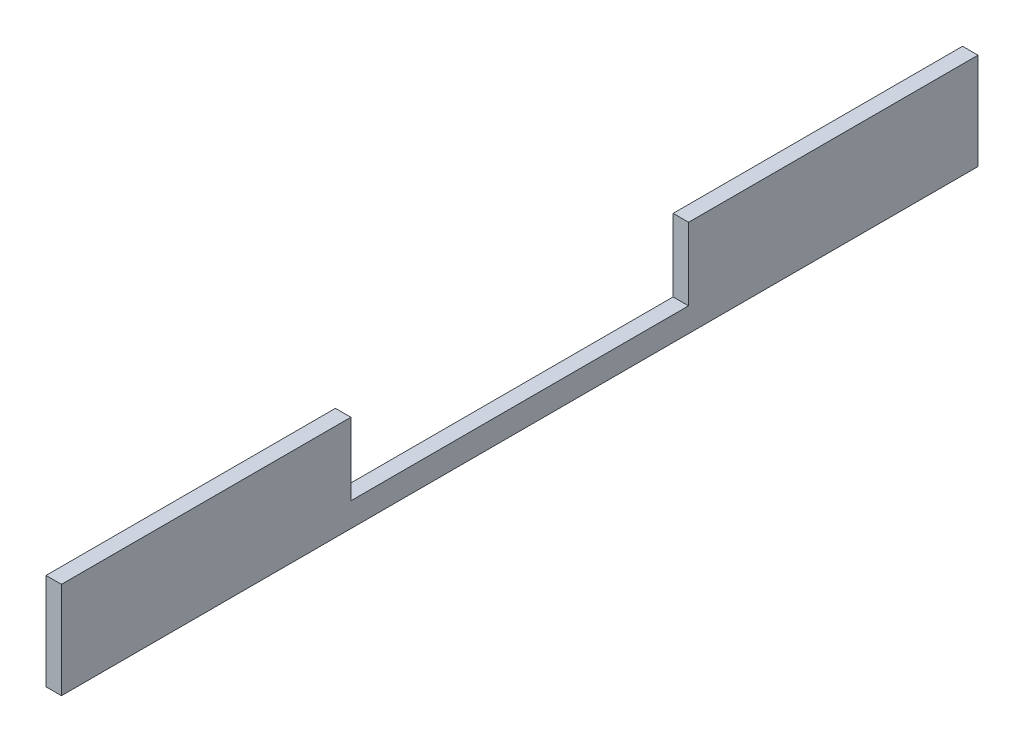
ISO-10303-21;
HEADER;
FILE_DESCRIPTION(('STEP AP214'),'2;1');
FILE_NAME('part.step','',(''),(''),'','','');
FILE_SCHEMA(('AUTOMOTIVE_DESIGN { 1 0 10303 214 1 1 1 1 }'));
ENDSEC;
DATA;
#1=APPLICATION_CONTEXT('core data for automotive mechanical design processes');
#2=APPLICATION_PROTOCOL_DEFINITION('international standard','automotive_design',2000,#1);
#3=PRODUCT_CONTEXT('',#1,'mechanical');
#4=PRODUCT('Part','Part','',(#3));
#5=PRODUCT_RELATED_PRODUCT_CATEGORY('part','',(#4));
#6=PRODUCT_DEFINITION_FORMATION('','',#4);
#7=PRODUCT_DEFINITION_CONTEXT('part definition',#1,'design');
#8=PRODUCT_DEFINITION('design','',#6,#7);
#9=PRODUCT_DEFINITION_SHAPE('','',#8);
#10=(LENGTH_UNIT() NAMED_UNIT(*) SI_UNIT(.MILLI.,.METRE.));
#11=(NAMED_UNIT(*) PLANE_ANGLE_UNIT() SI_UNIT($,.RADIAN.));
#12=(NAMED_UNIT(*) SI_UNIT($,.STERADIAN.) SOLID_ANGLE_UNIT());
#13=UNCERTAINTY_MEASURE_WITH_UNIT(LENGTH_MEASURE(1.E-05),#10,'distance_accuracy_value','');
#14=(GEOMETRIC_REPRESENTATION_CONTEXT(3) GLOBAL_UNCERTAINTY_ASSIGNED_CONTEXT((#13)) GLOBAL_UNIT_ASSIGNED_CONTEXT((#10,
#11,#12)) REPRESENTATION_CONTEXT('',''));
#15=CARTESIAN_POINT('',(0.,0.,0.));
#16=DIRECTION('',(0.,0.,1.));
#17=DIRECTION('',(1.,0.,0.));
#18=AXIS2_PLACEMENT_3D('',#15,#16,#17);
#19=CARTESIAN_POINT('',(3.2,20.,0.));
#20=DIRECTION('',(0.,-1.,0.));
#21=DIRECTION('',(0.,0.,-1.));
#22=AXIS2_PLACEMENT_3D('',#19,#20,#21);
#23=PLANE('',#22);
#24=DIRECTION('',(-1.,0.,0.));
#25=VECTOR('',#24,1.);
#26=CARTESIAN_POINT('',(10.,20.,-60.));
#27=LINE('',#26,#25);
#28=CARTESIAN_POINT('',(3.2,20.,-60.));
#29=VERTEX_POINT('',#28);
#30=CARTESIAN_POINT('',(0.,20.,-60.));
#31=VERTEX_POINT('',#30);
#32=EDGE_CURVE('E121',#29,#31,#27,.T.);
#33=ORIENTED_EDGE('',*,*,#32,.T.);
#34=DIRECTION('',(0.,0.,1.));
#35=VECTOR('',#34,1.);
#36=CARTESIAN_POINT('',(0.,20.,0.));
#37=LINE('',#36,#35);
#38=CARTESIAN_POINT('',(0.,20.,0.));
#39=VERTEX_POINT('',#38);
#40=EDGE_CURVE('E84',#31,#39,#37,.T.);
#41=ORIENTED_EDGE('',*,*,#40,.T.);
#42=DIRECTION('',(-1.,0.,0.));
#43=VECTOR('',#42,1.);
#44=CARTESIAN_POINT('',(3.2,20.,0.));
#45=LINE('',#44,#43);
#46=CARTESIAN_POINT('',(3.2,20.,0.));
#47=VERTEX_POINT('',#46);
#48=EDGE_CURVE('E154',#47,#39,#45,.T.);
#49=ORIENTED_EDGE('',*,*,#48,.F.);
#50=DIRECTION('',(0.,0.,1.));
#51=VECTOR('',#50,1.);
#52=CARTESIAN_POINT('',(3.2,20.,0.));
#53=LINE('',#52,#51);
#54=EDGE_CURVE('E62',#29,#47,#53,.T.);
#55=ORIENTED_EDGE('',*,*,#54,.F.);
#56=EDGE_LOOP('',(#33,#41,#49,#55));
#57=FACE_BOUND('',#56,.T.);
#58=ADVANCED_FACE('F38',(#57),#23,.F.);
#59=CARTESIAN_POINT('',(3.2,0.,0.));
#60=DIRECTION('',(0.,0.,-1.));
#61=DIRECTION('',(-1.,0.,0.));
#62=AXIS2_PLACEMENT_3D('',#59,#60,#61);
#63=PLANE('',#62);
#64=DIRECTION('',(0.,-1.,0.));
#65=VECTOR('',#64,1.);
#66=CARTESIAN_POINT('',(0.,0.,0.));
#67=LINE('',#66,#65);
#68=CARTESIAN_POINT('',(0.,0.,0.));
#69=VERTEX_POINT('',#68);
#70=EDGE_CURVE('E144',#39,#69,#67,.T.);
#71=ORIENTED_EDGE('',*,*,#70,.T.);
#72=DIRECTION('',(-1.,0.,0.));
#73=VECTOR('',#72,1.);
#74=CARTESIAN_POINT('',(3.2,0.,0.));
#75=LINE('',#74,#73);
#76=CARTESIAN_POINT('',(3.2,0.,0.));
#77=VERTEX_POINT('',#76);
#78=EDGE_CURVE('E11',#77,#69,#75,.T.);
#79=ORIENTED_EDGE('',*,*,#78,.F.);
#80=DIRECTION('',(0.,-1.,0.));
#81=VECTOR('',#80,1.);
#82=CARTESIAN_POINT('',(3.2,0.,0.));
#83=LINE('',#82,#81);
#84=EDGE_CURVE('E145',#47,#77,#83,.T.);
#85=ORIENTED_EDGE('',*,*,#84,.F.);
#86=ORIENTED_EDGE('',*,*,#48,.T.);
#87=EDGE_LOOP('',(#71,#79,#85,#86));
#88=FACE_BOUND('',#87,.T.);
#89=ADVANCED_FACE('F40',(#88),#63,.F.);
#90=CARTESIAN_POINT('',(3.2,0.,0.));
#91=DIRECTION('',(0.,1.,0.));
#92=DIRECTION('',(0.,0.,1.));
#93=AXIS2_PLACEMENT_3D('',#90,#91,#92);
#94=PLANE('',#93);
#95=DIRECTION('',(0.,0.,-1.));
#96=VECTOR('',#95,1.);
#97=CARTESIAN_POINT('',(0.,0.,0.));
#98=LINE('',#97,#96);
#99=CARTESIAN_POINT('',(0.,0.,-190.));
#100=VERTEX_POINT('',#99);
#101=EDGE_CURVE('E157',#69,#100,#98,.T.);
#102=ORIENTED_EDGE('',*,*,#101,.T.);
#103=DIRECTION('',(-1.,0.,0.));
#104=VECTOR('',#103,1.);
#105=CARTESIAN_POINT('',(3.2,0.,-190.));
#106=LINE('',#105,#104);
#107=CARTESIAN_POINT('',(3.2,0.,-190.));
#108=VERTEX_POINT('',#107);
#109=EDGE_CURVE('E46',#108,#100,#106,.T.);
#110=ORIENTED_EDGE('',*,*,#109,.F.);
#111=DIRECTION('',(0.,0.,-1.));
#112=VECTOR('',#111,1.);
#113=CARTESIAN_POINT('',(3.2,0.,0.));
#114=LINE('',#113,#112);
#115=EDGE_CURVE('E91',#77,#108,#114,.T.);
#116=ORIENTED_EDGE('',*,*,#115,.F.);
#117=ORIENTED_EDGE('',*,*,#78,.T.);
#118=EDGE_LOOP('',(#102,#110,#116,#117));
#119=FACE_BOUND('',#118,.T.);
#120=ADVANCED_FACE('F181',(#119),#94,.F.);
#121=CARTESIAN_POINT('',(3.2,0.,-190.));
#122=DIRECTION('',(0.,0.,1.));
#123=DIRECTION('',(1.,0.,0.));
#124=AXIS2_PLACEMENT_3D('',#121,#122,#123);
#125=PLANE('',#124);
#126=DIRECTION('',(0.,1.,0.));
#127=VECTOR('',#126,1.);
#128=CARTESIAN_POINT('',(0.,0.,-190.));
#129=LINE('',#128,#127);
#130=CARTESIAN_POINT('',(0.,20.,-190.));
#131=VERTEX_POINT('',#130);
#132=EDGE_CURVE('E159',#100,#131,#129,.T.);
#133=ORIENTED_EDGE('',*,*,#132,.T.);
#134=DIRECTION('',(-1.,0.,0.));
#135=VECTOR('',#134,1.);
#136=CARTESIAN_POINT('',(3.2,20.,-190.));
#137=LINE('',#136,#135);
#138=CARTESIAN_POINT('',(3.2,20.,-190.));
#139=VERTEX_POINT('',#138);
#140=EDGE_CURVE('E164',#139,#131,#137,.T.);
#141=ORIENTED_EDGE('',*,*,#140,.F.);
#142=DIRECTION('',(0.,1.,0.));
#143=VECTOR('',#142,1.);
#144=CARTESIAN_POINT('',(3.2,0.,-190.));
#145=LINE('',#144,#143);
#146=EDGE_CURVE('E149',#108,#139,#145,.T.);
#147=ORIENTED_EDGE('',*,*,#146,.F.);
#148=ORIENTED_EDGE('',*,*,#109,.T.);
#149=EDGE_LOOP('',(#133,#141,#147,#148));
#150=FACE_BOUND('',#149,.T.);
#151=ADVANCED_FACE('F170',(#150),#125,.F.);
#152=CARTESIAN_POINT('',(0.,20.,-130.));
#153=VERTEX_POINT('',#152);
#154=EDGE_CURVE('E147',#131,#153,#37,.T.);
#155=ORIENTED_EDGE('',*,*,#154,.T.);
#156=DIRECTION('',(-1.,0.,0.));
#157=VECTOR('',#156,1.);
#158=CARTESIAN_POINT('',(10.,20.,-130.));
#159=LINE('',#158,#157);
#160=CARTESIAN_POINT('',(3.2,20.,-130.));
#161=VERTEX_POINT('',#160);
#162=EDGE_CURVE('E135',#161,#153,#159,.T.);
#163=ORIENTED_EDGE('',*,*,#162,.F.);
#164=EDGE_CURVE('E151',#139,#161,#53,.T.);
#165=ORIENTED_EDGE('',*,*,#164,.F.);
#166=ORIENTED_EDGE('',*,*,#140,.T.);
#167=EDGE_LOOP('',(#155,#163,#165,#166));
#168=FACE_BOUND('',#167,.T.);
#169=ADVANCED_FACE('F175',(#168),#23,.F.);
#170=CARTESIAN_POINT('',(3.2,0.,0.));
#171=DIRECTION('',(-1.,0.,0.));
#172=DIRECTION('',(0.,0.,1.));
#173=AXIS2_PLACEMENT_3D('',#170,#171,#172);
#174=PLANE('',#173);
#175=ORIENTED_EDGE('',*,*,#164,.T.);
#176=DIRECTION('',(0.,-1.,0.));
#177=VECTOR('',#176,1.);
#178=CARTESIAN_POINT('',(3.2,0.,-130.));
#179=LINE('',#178,#177);
#180=CARTESIAN_POINT('',(3.2,5.,-130.));
#181=VERTEX_POINT('',#180);
#182=EDGE_CURVE('E141',#161,#181,#179,.T.);
#183=ORIENTED_EDGE('',*,*,#182,.T.);
#184=DIRECTION('',(0.,0.,1.));
#185=VECTOR('',#184,1.);
#186=CARTESIAN_POINT('',(3.2,5.00000000000001,0.));
#187=LINE('',#186,#185);
#188=CARTESIAN_POINT('',(3.2,5.00000000000001,-60.));
#189=VERTEX_POINT('',#188);
#190=EDGE_CURVE('E137',#181,#189,#187,.T.);
#191=ORIENTED_EDGE('',*,*,#190,.T.);
#192=DIRECTION('',(0.,-1.,0.));
#193=VECTOR('',#192,1.);
#194=CARTESIAN_POINT('',(3.2,0.,-60.));
#195=LINE('',#194,#193);
#196=EDGE_CURVE('E118',#29,#189,#195,.T.);
#197=ORIENTED_EDGE('',*,*,#196,.F.);
#198=ORIENTED_EDGE('',*,*,#54,.T.);
#199=ORIENTED_EDGE('',*,*,#84,.T.);
#200=ORIENTED_EDGE('',*,*,#115,.T.);
#201=ORIENTED_EDGE('',*,*,#146,.T.);
#202=EDGE_LOOP('',(#175,#183,#191,#197,#198,#199,#200,#201));
#203=FACE_BOUND('',#202,.T.);
#204=ADVANCED_FACE('F177',(#203),#174,.F.);
#205=CARTESIAN_POINT('',(0.,0.,0.));
#206=DIRECTION('',(-1.,0.,0.));
#207=DIRECTION('',(0.,0.,1.));
#208=AXIS2_PLACEMENT_3D('',#205,#206,#207);
#209=PLANE('',#208);
#210=DIRECTION('',(0.,-1.,0.));
#211=VECTOR('',#210,1.);
#212=CARTESIAN_POINT('',(0.,0.,-130.));
#213=LINE('',#212,#211);
#214=CARTESIAN_POINT('',(0.,5.,-130.));
#215=VERTEX_POINT('',#214);
#216=EDGE_CURVE('E53',#153,#215,#213,.T.);
#217=ORIENTED_EDGE('',*,*,#216,.F.);
#218=ORIENTED_EDGE('',*,*,#154,.F.);
#219=ORIENTED_EDGE('',*,*,#132,.F.);
#220=ORIENTED_EDGE('',*,*,#101,.F.);
#221=ORIENTED_EDGE('',*,*,#70,.F.);
#222=ORIENTED_EDGE('',*,*,#40,.F.);
#223=DIRECTION('',(0.,-1.,0.));
#224=VECTOR('',#223,1.);
#225=CARTESIAN_POINT('',(0.,0.,-60.));
#226=LINE('',#225,#224);
#227=CARTESIAN_POINT('',(0.,5.00000000000001,-60.));
#228=VERTEX_POINT('',#227);
#229=EDGE_CURVE('E117',#31,#228,#226,.T.);
#230=ORIENTED_EDGE('',*,*,#229,.T.);
#231=DIRECTION('',(0.,0.,1.));
#232=VECTOR('',#231,1.);
#233=CARTESIAN_POINT('',(0.,5.00000000000001,0.));
#234=LINE('',#233,#232);
#235=EDGE_CURVE('E125',#215,#228,#234,.T.);
#236=ORIENTED_EDGE('',*,*,#235,.F.);
#237=EDGE_LOOP('',(#217,#218,#219,#220,#221,#222,#230,#236));
#238=FACE_BOUND('',#237,.T.);
#239=ADVANCED_FACE('F129',(#238),#209,.T.);
#240=CARTESIAN_POINT('',(10.,0.,-130.));
#241=DIRECTION('',(0.,0.,-1.));
#242=DIRECTION('',(-1.,0.,0.));
#243=AXIS2_PLACEMENT_3D('',#240,#241,#242);
#244=PLANE('',#243);
#245=ORIENTED_EDGE('',*,*,#162,.T.);
#246=ORIENTED_EDGE('',*,*,#216,.T.);
#247=DIRECTION('',(-1.,0.,0.));
#248=VECTOR('',#247,1.);
#249=CARTESIAN_POINT('',(10.,5.,-130.));
#250=LINE('',#249,#248);
#251=EDGE_CURVE('E122',#181,#215,#250,.T.);
#252=ORIENTED_EDGE('',*,*,#251,.F.);
#253=ORIENTED_EDGE('',*,*,#182,.F.);
#254=EDGE_LOOP('',(#245,#246,#252,#253));
#255=FACE_BOUND('',#254,.T.);
#256=ADVANCED_FACE('F201',(#255),#244,.F.);
#257=CARTESIAN_POINT('',(10.,0.,-60.));
#258=DIRECTION('',(0.,0.,-1.));
#259=DIRECTION('',(-1.,0.,0.));
#260=AXIS2_PLACEMENT_3D('',#257,#258,#259);
#261=PLANE('',#260);
#262=ORIENTED_EDGE('',*,*,#196,.T.);
#263=DIRECTION('',(-1.,0.,0.));
#264=VECTOR('',#263,1.);
#265=CARTESIAN_POINT('',(10.,5.00000000000001,-60.));
#266=LINE('',#265,#264);
#267=EDGE_CURVE('E113',#189,#228,#266,.T.);
#268=ORIENTED_EDGE('',*,*,#267,.T.);
#269=ORIENTED_EDGE('',*,*,#229,.F.);
#270=ORIENTED_EDGE('',*,*,#32,.F.);
#271=EDGE_LOOP('',(#262,#268,#269,#270));
#272=FACE_BOUND('',#271,.T.);
#273=ADVANCED_FACE('F115',(#272),#261,.T.);
#274=CARTESIAN_POINT('',(10.,5.00000000000001,0.));
#275=DIRECTION('',(0.,-1.,0.));
#276=DIRECTION('',(0.,0.,-1.));
#277=AXIS2_PLACEMENT_3D('',#274,#275,#276);
#278=PLANE('',#277);
#279=ORIENTED_EDGE('',*,*,#251,.T.);
#280=ORIENTED_EDGE('',*,*,#235,.T.);
#281=ORIENTED_EDGE('',*,*,#267,.F.);
#282=ORIENTED_EDGE('',*,*,#190,.F.);
#283=EDGE_LOOP('',(#279,#280,#281,#282));
#284=FACE_BOUND('',#283,.T.);
#285=ADVANCED_FACE('F126',(#284),#278,.F.);
#286=CLOSED_SHELL('',(#58,#89,#120,#151,#169,#204,#239,#256,#273,#285));
#287=MANIFOLD_SOLID_BREP('B2',#286);
#288=ADVANCED_BREP_SHAPE_REPRESENTATION('',(#18,#287),#14);
#289=SHAPE_DEFINITION_REPRESENTATION(#9,#288);
ENDSEC;
END-ISO-10303-21;
